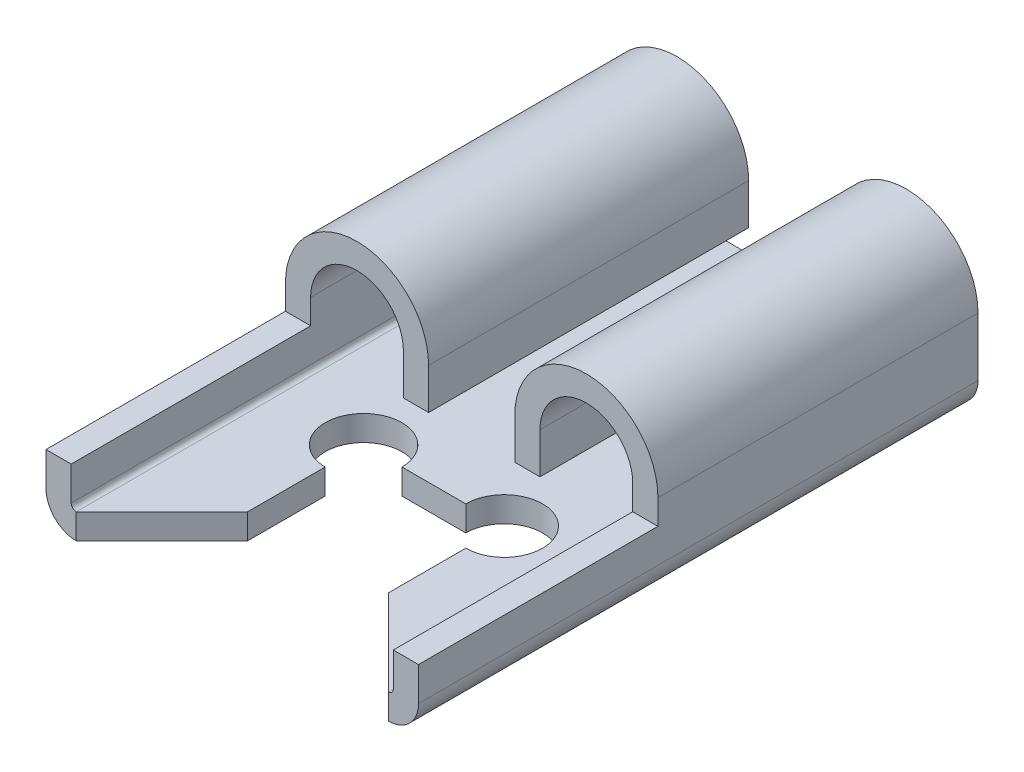
ISO-10303-21;
HEADER;
FILE_DESCRIPTION(('STEP AP214'),'2;1');
FILE_NAME('part.step','',(''),(''),'','','');
FILE_SCHEMA(('AUTOMOTIVE_DESIGN { 1 0 10303 214 1 1 1 1 }'));
ENDSEC;
DATA;
#1=APPLICATION_CONTEXT('core data for automotive mechanical design processes');
#2=APPLICATION_PROTOCOL_DEFINITION('international standard','automotive_design',2000,#1);
#3=PRODUCT_CONTEXT('',#1,'mechanical');
#4=PRODUCT('Part','Part','',(#3));
#5=PRODUCT_RELATED_PRODUCT_CATEGORY('part','',(#4));
#6=PRODUCT_DEFINITION_FORMATION('','',#4);
#7=PRODUCT_DEFINITION_CONTEXT('part definition',#1,'design');
#8=PRODUCT_DEFINITION('design','',#6,#7);
#9=PRODUCT_DEFINITION_SHAPE('','',#8);
#10=(LENGTH_UNIT() NAMED_UNIT(*) SI_UNIT(.MILLI.,.METRE.));
#11=(NAMED_UNIT(*) PLANE_ANGLE_UNIT() SI_UNIT($,.RADIAN.));
#12=(NAMED_UNIT(*) SI_UNIT($,.STERADIAN.) SOLID_ANGLE_UNIT());
#13=UNCERTAINTY_MEASURE_WITH_UNIT(LENGTH_MEASURE(1.E-05),#10,'distance_accuracy_value','');
#14=(GEOMETRIC_REPRESENTATION_CONTEXT(3) GLOBAL_UNCERTAINTY_ASSIGNED_CONTEXT((#13)) GLOBAL_UNIT_ASSIGNED_CONTEXT((#10,
#11,#12)) REPRESENTATION_CONTEXT('',''));
#15=CARTESIAN_POINT('',(0.,0.,0.));
#16=DIRECTION('',(0.,0.,1.));
#17=DIRECTION('',(1.,0.,0.));
#18=AXIS2_PLACEMENT_3D('',#15,#16,#17);
#19=CARTESIAN_POINT('',(-2.275,1.76,-11.1));
#20=DIRECTION('',(0.,0.,1.));
#21=DIRECTION('',(1.,0.,0.));
#22=AXIS2_PLACEMENT_3D('',#19,#20,#21);
#23=CYLINDRICAL_SURFACE('',#22,1.42);
#24=DIRECTION('',(0.,0.,1.));
#25=VECTOR('',#24,1.);
#26=CARTESIAN_POINT('',(-3.695,1.76,-11.1));
#27=LINE('',#26,#25);
#28=CARTESIAN_POINT('',(-3.695,1.76,-11.1));
#29=VERTEX_POINT('',#28);
#30=CARTESIAN_POINT('',(-3.695,1.76,-4.75));
#31=VERTEX_POINT('',#30);
#32=EDGE_CURVE('E432',#29,#31,#27,.T.);
#33=ORIENTED_EDGE('',*,*,#32,.T.);
#34=CARTESIAN_POINT('',(-2.275,1.76,-4.75));
#35=DIRECTION('',(0.,0.,1.));
#36=DIRECTION('',(1.,0.,0.));
#37=AXIS2_PLACEMENT_3D('',#34,#35,#36);
#38=CIRCLE('',#37,1.42);
#39=CARTESIAN_POINT('',(-0.855,1.76,-4.75));
#40=VERTEX_POINT('',#39);
#41=EDGE_CURVE('E233',#31,#40,#38,.F.);
#42=ORIENTED_EDGE('',*,*,#41,.T.);
#43=DIRECTION('',(0.,0.,1.));
#44=VECTOR('',#43,1.);
#45=CARTESIAN_POINT('',(-0.855,1.76,-11.1));
#46=LINE('',#45,#44);
#47=CARTESIAN_POINT('',(-0.855,1.76,-11.1));
#48=VERTEX_POINT('',#47);
#49=EDGE_CURVE('E434',#48,#40,#46,.T.);
#50=ORIENTED_EDGE('',*,*,#49,.F.);
#51=CARTESIAN_POINT('',(-2.275,1.76,-11.1));
#52=DIRECTION('',(0.,0.,1.));
#53=DIRECTION('',(1.,0.,0.));
#54=AXIS2_PLACEMENT_3D('',#51,#52,#53);
#55=CIRCLE('',#54,1.42);
#56=EDGE_CURVE('E403',#48,#29,#55,.T.);
#57=ORIENTED_EDGE('',*,*,#56,.T.);
#58=EDGE_LOOP('',(#33,#42,#50,#57));
#59=FACE_BOUND('',#58,.T.);
#60=ADVANCED_FACE('F35',(#59),#23,.T.);
#61=CARTESIAN_POINT('',(-0.855,1.76,-11.1));
#62=DIRECTION('',(1.,0.,0.));
#63=DIRECTION('',(0.,1.,0.));
#64=AXIS2_PLACEMENT_3D('',#61,#62,#63);
#65=PLANE('',#64);
#66=ORIENTED_EDGE('',*,*,#49,.T.);
#67=DIRECTION('',(0.,-1.,0.));
#68=VECTOR('',#67,1.);
#69=CARTESIAN_POINT('',(-0.855,1.76,-4.75));
#70=LINE('',#69,#68);
#71=CARTESIAN_POINT('',(-0.855,0.95,-4.75));
#72=VERTEX_POINT('',#71);
#73=EDGE_CURVE('E289',#40,#72,#70,.T.);
#74=ORIENTED_EDGE('',*,*,#73,.T.);
#75=DIRECTION('',(0.,0.,1.));
#76=VECTOR('',#75,1.);
#77=CARTESIAN_POINT('',(-0.855,0.95,-11.1));
#78=LINE('',#77,#76);
#79=CARTESIAN_POINT('',(-0.855,0.95,-11.1));
#80=VERTEX_POINT('',#79);
#81=EDGE_CURVE('E437',#80,#72,#78,.T.);
#82=ORIENTED_EDGE('',*,*,#81,.F.);
#83=DIRECTION('',(0.,1.,0.));
#84=VECTOR('',#83,1.);
#85=CARTESIAN_POINT('',(-0.855,1.76,-11.1));
#86=LINE('',#85,#84);
#87=EDGE_CURVE('E400',#80,#48,#86,.T.);
#88=ORIENTED_EDGE('',*,*,#87,.T.);
#89=EDGE_LOOP('',(#66,#74,#82,#88));
#90=FACE_BOUND('',#89,.T.);
#91=ADVANCED_FACE('F545',(#90),#65,.T.);
#92=CARTESIAN_POINT('',(-1.355,0.95,-11.1));
#93=DIRECTION('',(0.,-1.,0.));
#94=DIRECTION('',(1.,0.,0.));
#95=AXIS2_PLACEMENT_3D('',#92,#93,#94);
#96=PLANE('',#95);
#97=ORIENTED_EDGE('',*,*,#81,.T.);
#98=DIRECTION('',(-1.,0.,0.));
#99=VECTOR('',#98,1.);
#100=CARTESIAN_POINT('',(-1.355,0.95,-4.75));
#101=LINE('',#100,#99);
#102=CARTESIAN_POINT('',(-1.355,0.95,-4.75));
#103=VERTEX_POINT('',#102);
#104=EDGE_CURVE('E286',#72,#103,#101,.T.);
#105=ORIENTED_EDGE('',*,*,#104,.T.);
#106=DIRECTION('',(0.,0.,1.));
#107=VECTOR('',#106,1.);
#108=CARTESIAN_POINT('',(-1.355,0.95,-11.1));
#109=LINE('',#108,#107);
#110=CARTESIAN_POINT('',(-1.355,0.95,-11.1));
#111=VERTEX_POINT('',#110);
#112=EDGE_CURVE('E440',#111,#103,#109,.T.);
#113=ORIENTED_EDGE('',*,*,#112,.F.);
#114=DIRECTION('',(1.,0.,0.));
#115=VECTOR('',#114,1.);
#116=CARTESIAN_POINT('',(-1.355,0.95,-11.1));
#117=LINE('',#116,#115);
#118=EDGE_CURVE('E397',#111,#80,#117,.T.);
#119=ORIENTED_EDGE('',*,*,#118,.T.);
#120=EDGE_LOOP('',(#97,#105,#113,#119));
#121=FACE_BOUND('',#120,.T.);
#122=ADVANCED_FACE('F540',(#121),#96,.T.);
#123=CARTESIAN_POINT('',(-1.355,1.76,-11.1));
#124=DIRECTION('',(-1.,0.,0.));
#125=DIRECTION('',(0.,0.,1.));
#126=AXIS2_PLACEMENT_3D('',#123,#124,#125);
#127=PLANE('',#126);
#128=ORIENTED_EDGE('',*,*,#112,.T.);
#129=DIRECTION('',(0.,1.,0.));
#130=VECTOR('',#129,1.);
#131=CARTESIAN_POINT('',(-1.355,1.76,-4.75));
#132=LINE('',#131,#130);
#133=CARTESIAN_POINT('',(-1.355,1.76,-4.75));
#134=VERTEX_POINT('',#133);
#135=EDGE_CURVE('E283',#103,#134,#132,.T.);
#136=ORIENTED_EDGE('',*,*,#135,.T.);
#137=DIRECTION('',(0.,0.,1.));
#138=VECTOR('',#137,1.);
#139=CARTESIAN_POINT('',(-1.355,1.76,-11.1));
#140=LINE('',#139,#138);
#141=CARTESIAN_POINT('',(-1.355,1.76,-11.1));
#142=VERTEX_POINT('',#141);
#143=EDGE_CURVE('E443',#142,#134,#140,.T.);
#144=ORIENTED_EDGE('',*,*,#143,.F.);
#145=DIRECTION('',(0.,-1.,0.));
#146=VECTOR('',#145,1.);
#147=CARTESIAN_POINT('',(-1.355,1.76,-11.1));
#148=LINE('',#147,#146);
#149=EDGE_CURVE('E394',#142,#111,#148,.T.);
#150=ORIENTED_EDGE('',*,*,#149,.T.);
#151=EDGE_LOOP('',(#128,#136,#144,#150));
#152=FACE_BOUND('',#151,.T.);
#153=ADVANCED_FACE('F538',(#152),#127,.T.);
#154=CARTESIAN_POINT('',(-2.275,1.76,-11.1));
#155=DIRECTION('',(0.,0.,1.));
#156=DIRECTION('',(1.,0.,0.));
#157=AXIS2_PLACEMENT_3D('',#154,#155,#156);
#158=CYLINDRICAL_SURFACE('',#157,0.92);
#159=ORIENTED_EDGE('',*,*,#143,.T.);
#160=CARTESIAN_POINT('',(-2.275,1.76,-4.75));
#161=DIRECTION('',(0.,0.,1.));
#162=DIRECTION('',(1.,0.,0.));
#163=AXIS2_PLACEMENT_3D('',#160,#161,#162);
#164=CIRCLE('',#163,0.92);
#165=CARTESIAN_POINT('',(-3.195,1.76,-4.75));
#166=VERTEX_POINT('',#165);
#167=EDGE_CURVE('E280',#134,#166,#164,.T.);
#168=ORIENTED_EDGE('',*,*,#167,.T.);
#169=DIRECTION('',(0.,0.,1.));
#170=VECTOR('',#169,1.);
#171=CARTESIAN_POINT('',(-3.195,1.76,-11.1));
#172=LINE('',#171,#170);
#173=CARTESIAN_POINT('',(-3.195,1.76,-11.1));
#174=VERTEX_POINT('',#173);
#175=EDGE_CURVE('E446',#174,#166,#172,.T.);
#176=ORIENTED_EDGE('',*,*,#175,.F.);
#177=CARTESIAN_POINT('',(-2.275,1.76,-11.1));
#178=DIRECTION('',(0.,0.,-1.));
#179=DIRECTION('',(1.,0.,0.));
#180=AXIS2_PLACEMENT_3D('',#177,#178,#179);
#181=CIRCLE('',#180,0.92);
#182=EDGE_CURVE('E391',#174,#142,#181,.T.);
#183=ORIENTED_EDGE('',*,*,#182,.T.);
#184=EDGE_LOOP('',(#159,#168,#176,#183));
#185=FACE_BOUND('',#184,.T.);
#186=ADVANCED_FACE('F536',(#185),#158,.F.);
#187=CARTESIAN_POINT('',(2.275,1.76,-11.1));
#188=DIRECTION('',(0.,0.,1.));
#189=DIRECTION('',(1.,0.,0.));
#190=AXIS2_PLACEMENT_3D('',#187,#188,#189);
#191=CYLINDRICAL_SURFACE('',#190,0.92);
#192=DIRECTION('',(0.,0.,1.));
#193=VECTOR('',#192,1.);
#194=CARTESIAN_POINT('',(3.195,1.76,-11.1));
#195=LINE('',#194,#193);
#196=CARTESIAN_POINT('',(3.195,1.76,-11.1));
#197=VERTEX_POINT('',#196);
#198=CARTESIAN_POINT('',(3.195,1.76,-4.75));
#199=VERTEX_POINT('',#198);
#200=EDGE_CURVE('E460',#197,#199,#195,.T.);
#201=ORIENTED_EDGE('',*,*,#200,.T.);
#202=CARTESIAN_POINT('',(2.275,1.76,-4.75));
#203=DIRECTION('',(0.,0.,1.));
#204=DIRECTION('',(1.,0.,0.));
#205=AXIS2_PLACEMENT_3D('',#202,#203,#204);
#206=CIRCLE('',#205,0.92);
#207=CARTESIAN_POINT('',(1.355,1.76,-4.75));
#208=VERTEX_POINT('',#207);
#209=EDGE_CURVE('E272',#199,#208,#206,.T.);
#210=ORIENTED_EDGE('',*,*,#209,.T.);
#211=DIRECTION('',(0.,0.,1.));
#212=VECTOR('',#211,1.);
#213=CARTESIAN_POINT('',(1.355,1.76,-11.1));
#214=LINE('',#213,#212);
#215=CARTESIAN_POINT('',(1.355,1.76,-11.1));
#216=VERTEX_POINT('',#215);
#217=EDGE_CURVE('E463',#216,#208,#214,.T.);
#218=ORIENTED_EDGE('',*,*,#217,.F.);
#219=CARTESIAN_POINT('',(2.275,1.76,-11.1));
#220=DIRECTION('',(0.,0.,-1.));
#221=DIRECTION('',(-1.,0.,0.));
#222=AXIS2_PLACEMENT_3D('',#219,#220,#221);
#223=CIRCLE('',#222,0.92);
#224=EDGE_CURVE('E374',#216,#197,#223,.T.);
#225=ORIENTED_EDGE('',*,*,#224,.T.);
#226=EDGE_LOOP('',(#201,#210,#218,#225));
#227=FACE_BOUND('',#226,.T.);
#228=ADVANCED_FACE('F559',(#227),#191,.F.);
#229=CARTESIAN_POINT('',(1.355,1.76,-11.1));
#230=DIRECTION('',(1.,0.,0.));
#231=DIRECTION('',(0.,1.,0.));
#232=AXIS2_PLACEMENT_3D('',#229,#230,#231);
#233=PLANE('',#232);
#234=ORIENTED_EDGE('',*,*,#217,.T.);
#235=DIRECTION('',(0.,-1.,0.));
#236=VECTOR('',#235,1.);
#237=CARTESIAN_POINT('',(1.355,1.76,-4.75));
#238=LINE('',#237,#236);
#239=CARTESIAN_POINT('',(1.355,0.95,-4.75));
#240=VERTEX_POINT('',#239);
#241=EDGE_CURVE('E269',#208,#240,#238,.T.);
#242=ORIENTED_EDGE('',*,*,#241,.T.);
#243=DIRECTION('',(0.,0.,1.));
#244=VECTOR('',#243,1.);
#245=CARTESIAN_POINT('',(1.355,0.95,-11.1));
#246=LINE('',#245,#244);
#247=CARTESIAN_POINT('',(1.355,0.95,-11.1));
#248=VERTEX_POINT('',#247);
#249=EDGE_CURVE('E466',#248,#240,#246,.T.);
#250=ORIENTED_EDGE('',*,*,#249,.F.);
#251=DIRECTION('',(0.,1.,0.));
#252=VECTOR('',#251,1.);
#253=CARTESIAN_POINT('',(1.355,1.76,-11.1));
#254=LINE('',#253,#252);
#255=EDGE_CURVE('E371',#248,#216,#254,.T.);
#256=ORIENTED_EDGE('',*,*,#255,.T.);
#257=EDGE_LOOP('',(#234,#242,#250,#256));
#258=FACE_BOUND('',#257,.T.);
#259=ADVANCED_FACE('F561',(#258),#233,.T.);
#260=CARTESIAN_POINT('',(1.355,0.95,-11.1));
#261=DIRECTION('',(0.,-1.,0.));
#262=DIRECTION('',(1.,0.,0.));
#263=AXIS2_PLACEMENT_3D('',#260,#261,#262);
#264=PLANE('',#263);
#265=ORIENTED_EDGE('',*,*,#249,.T.);
#266=DIRECTION('',(-1.,0.,0.));
#267=VECTOR('',#266,1.);
#268=CARTESIAN_POINT('',(1.355,0.95,-4.75));
#269=LINE('',#268,#267);
#270=CARTESIAN_POINT('',(0.855,0.95,-4.75));
#271=VERTEX_POINT('',#270);
#272=EDGE_CURVE('E266',#240,#271,#269,.T.);
#273=ORIENTED_EDGE('',*,*,#272,.T.);
#274=DIRECTION('',(0.,0.,1.));
#275=VECTOR('',#274,1.);
#276=CARTESIAN_POINT('',(0.855,0.95,-11.1));
#277=LINE('',#276,#275);
#278=CARTESIAN_POINT('',(0.855,0.95,-11.1));
#279=VERTEX_POINT('',#278);
#280=EDGE_CURVE('E469',#279,#271,#277,.T.);
#281=ORIENTED_EDGE('',*,*,#280,.F.);
#282=DIRECTION('',(1.,0.,0.));
#283=VECTOR('',#282,1.);
#284=CARTESIAN_POINT('',(1.355,0.95,-11.1));
#285=LINE('',#284,#283);
#286=EDGE_CURVE('E368',#279,#248,#285,.T.);
#287=ORIENTED_EDGE('',*,*,#286,.T.);
#288=EDGE_LOOP('',(#265,#273,#281,#287));
#289=FACE_BOUND('',#288,.T.);
#290=ADVANCED_FACE('F565',(#289),#264,.T.);
#291=CARTESIAN_POINT('',(0.855,1.76,-11.1));
#292=DIRECTION('',(-1.,0.,0.));
#293=DIRECTION('',(0.,-1.,0.));
#294=AXIS2_PLACEMENT_3D('',#291,#292,#293);
#295=PLANE('',#294);
#296=ORIENTED_EDGE('',*,*,#280,.T.);
#297=DIRECTION('',(0.,1.,0.));
#298=VECTOR('',#297,1.);
#299=CARTESIAN_POINT('',(0.855,1.76,-4.75));
#300=LINE('',#299,#298);
#301=CARTESIAN_POINT('',(0.855,1.76,-4.75));
#302=VERTEX_POINT('',#301);
#303=EDGE_CURVE('E263',#271,#302,#300,.T.);
#304=ORIENTED_EDGE('',*,*,#303,.T.);
#305=DIRECTION('',(0.,0.,1.));
#306=VECTOR('',#305,1.);
#307=CARTESIAN_POINT('',(0.855,1.76,-11.1));
#308=LINE('',#307,#306);
#309=CARTESIAN_POINT('',(0.855,1.76,-11.1));
#310=VERTEX_POINT('',#309);
#311=EDGE_CURVE('E472',#310,#302,#308,.T.);
#312=ORIENTED_EDGE('',*,*,#311,.F.);
#313=DIRECTION('',(0.,-1.,0.));
#314=VECTOR('',#313,1.);
#315=CARTESIAN_POINT('',(0.855,1.76,-11.1));
#316=LINE('',#315,#314);
#317=EDGE_CURVE('E365',#310,#279,#316,.T.);
#318=ORIENTED_EDGE('',*,*,#317,.T.);
#319=EDGE_LOOP('',(#296,#304,#312,#318));
#320=FACE_BOUND('',#319,.T.);
#321=ADVANCED_FACE('F567',(#320),#295,.T.);
#322=CARTESIAN_POINT('',(2.275,1.76,-11.1));
#323=DIRECTION('',(0.,0.,1.));
#324=DIRECTION('',(1.,0.,0.));
#325=AXIS2_PLACEMENT_3D('',#322,#323,#324);
#326=CYLINDRICAL_SURFACE('',#325,1.42);
#327=ORIENTED_EDGE('',*,*,#311,.T.);
#328=CARTESIAN_POINT('',(2.275,1.76,-4.75));
#329=DIRECTION('',(0.,0.,1.));
#330=DIRECTION('',(1.,0.,0.));
#331=AXIS2_PLACEMENT_3D('',#328,#329,#330);
#332=CIRCLE('',#331,1.42);
#333=CARTESIAN_POINT('',(3.695,1.76,-4.75));
#334=VERTEX_POINT('',#333);
#335=EDGE_CURVE('E260',#302,#334,#332,.F.);
#336=ORIENTED_EDGE('',*,*,#335,.T.);
#337=DIRECTION('',(0.,0.,1.));
#338=VECTOR('',#337,1.);
#339=CARTESIAN_POINT('',(3.695,1.76,-11.1));
#340=LINE('',#339,#338);
#341=CARTESIAN_POINT('',(3.695,1.76,-11.1));
#342=VERTEX_POINT('',#341);
#343=EDGE_CURVE('E475',#342,#334,#340,.T.);
#344=ORIENTED_EDGE('',*,*,#343,.F.);
#345=CARTESIAN_POINT('',(2.275,1.76,-11.1));
#346=DIRECTION('',(0.,0.,1.));
#347=DIRECTION('',(-1.,0.,0.));
#348=AXIS2_PLACEMENT_3D('',#345,#346,#347);
#349=CIRCLE('',#348,1.42);
#350=EDGE_CURVE('E362',#342,#310,#349,.T.);
#351=ORIENTED_EDGE('',*,*,#350,.T.);
#352=EDGE_LOOP('',(#327,#336,#344,#351));
#353=FACE_BOUND('',#352,.T.);
#354=ADVANCED_FACE('F570',(#353),#326,.T.);
#355=CARTESIAN_POINT('',(-3.095,0.599999999999999,0.));
#356=DIRECTION('',(0.,0.,-1.));
#357=DIRECTION('',(-1.,0.,0.));
#358=AXIS2_PLACEMENT_3D('',#355,#356,#357);
#359=PLANE('',#358);
#360=DIRECTION('',(0.,1.,0.));
#361=VECTOR('',#360,1.);
#362=CARTESIAN_POINT('',(-3.195,0.599999999999999,0.));
#363=LINE('',#362,#361);
#364=CARTESIAN_POINT('',(-3.195,0.599999999999999,0.));
#365=VERTEX_POINT('',#364);
#366=CARTESIAN_POINT('',(-3.195,1.27,0.));
#367=VERTEX_POINT('',#366);
#368=EDGE_CURVE('E426',#365,#367,#363,.T.);
#369=ORIENTED_EDGE('',*,*,#368,.T.);
#370=DIRECTION('',(1.,0.,0.));
#371=VECTOR('',#370,1.);
#372=CARTESIAN_POINT('',(-3.695,1.27,0.));
#373=LINE('',#372,#371);
#374=CARTESIAN_POINT('',(-3.695,1.27,0.));
#375=VERTEX_POINT('',#374);
#376=EDGE_CURVE('E237',#375,#367,#373,.T.);
#377=ORIENTED_EDGE('',*,*,#376,.F.);
#378=DIRECTION('',(0.,-1.,0.));
#379=VECTOR('',#378,1.);
#380=CARTESIAN_POINT('',(-3.695,0.599999999999999,0.));
#381=LINE('',#380,#379);
#382=CARTESIAN_POINT('',(-3.695,0.599999999999999,0.));
#383=VERTEX_POINT('',#382);
#384=EDGE_CURVE('E250',#375,#383,#381,.T.);
#385=ORIENTED_EDGE('',*,*,#384,.T.);
#386=CARTESIAN_POINT('',(-3.095,0.599999999999999,0.));
#387=DIRECTION('',(0.,0.,1.));
#388=DIRECTION('',(-1.,0.,0.));
#389=AXIS2_PLACEMENT_3D('',#386,#387,#388);
#390=CIRCLE('',#389,0.6);
#391=CARTESIAN_POINT('',(-3.095,0.,0.));
#392=VERTEX_POINT('',#391);
#393=EDGE_CURVE('E349',#383,#392,#390,.T.);
#394=ORIENTED_EDGE('',*,*,#393,.T.);
#395=DIRECTION('',(0.,-1.,0.));
#396=VECTOR('',#395,1.);
#397=CARTESIAN_POINT('',(-3.095,3.181,0.));
#398=LINE('',#397,#396);
#399=CARTESIAN_POINT('',(-3.095,0.499999999999999,0.));
#400=VERTEX_POINT('',#399);
#401=EDGE_CURVE('E347',#400,#392,#398,.T.);
#402=ORIENTED_EDGE('',*,*,#401,.F.);
#403=CARTESIAN_POINT('',(-3.095,0.599999999999999,0.));
#404=DIRECTION('',(0.,0.,-1.));
#405=DIRECTION('',(-1.,0.,0.));
#406=AXIS2_PLACEMENT_3D('',#403,#404,#405);
#407=CIRCLE('',#406,0.0999999999999998);
#408=EDGE_CURVE('E423',#400,#365,#407,.T.);
#409=ORIENTED_EDGE('',*,*,#408,.T.);
#410=EDGE_LOOP('',(#369,#377,#385,#394,#402,#409));
#411=FACE_BOUND('',#410,.T.);
#412=ADVANCED_FACE('F520',(#411),#359,.F.);
#413=CARTESIAN_POINT('',(-3.095,0.599999999999999,-11.1));
#414=DIRECTION('',(0.,0.,1.));
#415=DIRECTION('',(1.,0.,0.));
#416=AXIS2_PLACEMENT_3D('',#413,#414,#415);
#417=CYLINDRICAL_SURFACE('',#416,0.6);
#418=ORIENTED_EDGE('',*,*,#393,.F.);
#419=DIRECTION('',(0.,0.,1.));
#420=VECTOR('',#419,1.);
#421=CARTESIAN_POINT('',(-3.695,0.599999999999999,-11.1));
#422=LINE('',#421,#420);
#423=CARTESIAN_POINT('',(-3.695,0.599999999999999,-11.1));
#424=VERTEX_POINT('',#423);
#425=EDGE_CURVE('E430',#424,#383,#422,.T.);
#426=ORIENTED_EDGE('',*,*,#425,.F.);
#427=CARTESIAN_POINT('',(-3.095,0.599999999999999,-11.1));
#428=DIRECTION('',(0.,0.,1.));
#429=DIRECTION('',(-1.,0.,0.));
#430=AXIS2_PLACEMENT_3D('',#427,#428,#429);
#431=CIRCLE('',#430,0.6);
#432=CARTESIAN_POINT('',(-3.095,0.,-11.1));
#433=VERTEX_POINT('',#432);
#434=EDGE_CURVE('E351',#424,#433,#431,.T.);
#435=ORIENTED_EDGE('',*,*,#434,.T.);
#436=DIRECTION('',(0.,0.,1.));
#437=VECTOR('',#436,1.);
#438=CARTESIAN_POINT('',(-3.095,0.,-11.1));
#439=LINE('',#438,#437);
#440=EDGE_CURVE('E409',#433,#392,#439,.T.);
#441=ORIENTED_EDGE('',*,*,#440,.T.);
#442=EDGE_LOOP('',(#418,#426,#435,#441));
#443=FACE_BOUND('',#442,.T.);
#444=ADVANCED_FACE('F37',(#443),#417,.T.);
#445=CARTESIAN_POINT('',(-3.695,0.599999999999999,-11.1));
#446=DIRECTION('',(-1.,0.,0.));
#447=DIRECTION('',(0.,-1.,0.));
#448=AXIS2_PLACEMENT_3D('',#445,#446,#447);
#449=PLANE('',#448);
#450=DIRECTION('',(0.,0.,1.));
#451=VECTOR('',#450,1.);
#452=CARTESIAN_POINT('',(-3.695,1.27,-4.75));
#453=LINE('',#452,#451);
#454=CARTESIAN_POINT('',(-3.695,1.27,-4.75));
#455=VERTEX_POINT('',#454);
#456=EDGE_CURVE('E241',#455,#375,#453,.T.);
#457=ORIENTED_EDGE('',*,*,#456,.F.);
#458=DIRECTION('',(0.,-1.,0.));
#459=VECTOR('',#458,1.);
#460=CARTESIAN_POINT('',(-3.695,3.31172477789102,-4.75));
#461=LINE('',#460,#459);
#462=EDGE_CURVE('E230',#31,#455,#461,.T.);
#463=ORIENTED_EDGE('',*,*,#462,.F.);
#464=ORIENTED_EDGE('',*,*,#32,.F.);
#465=DIRECTION('',(0.,-1.,0.));
#466=VECTOR('',#465,1.);
#467=CARTESIAN_POINT('',(-3.695,0.599999999999999,-11.1));
#468=LINE('',#467,#466);
#469=EDGE_CURVE('E406',#29,#424,#468,.T.);
#470=ORIENTED_EDGE('',*,*,#469,.T.);
#471=ORIENTED_EDGE('',*,*,#425,.T.);
#472=ORIENTED_EDGE('',*,*,#384,.F.);
#473=EDGE_LOOP('',(#457,#463,#464,#470,#471,#472));
#474=FACE_BOUND('',#473,.T.);
#475=ADVANCED_FACE('F248',(#474),#449,.T.);
#476=CARTESIAN_POINT('',(-3.195,0.599999999999999,-11.1));
#477=DIRECTION('',(1.,0.,0.));
#478=DIRECTION('',(0.,0.,-1.));
#479=AXIS2_PLACEMENT_3D('',#476,#477,#478);
#480=PLANE('',#479);
#481=DIRECTION('',(0.,0.,-1.));
#482=VECTOR('',#481,1.);
#483=CARTESIAN_POINT('',(-3.195,1.27,-11.1));
#484=LINE('',#483,#482);
#485=CARTESIAN_POINT('',(-3.195,1.27,-4.75));
#486=VERTEX_POINT('',#485);
#487=EDGE_CURVE('E11',#367,#486,#484,.T.);
#488=ORIENTED_EDGE('',*,*,#487,.F.);
#489=ORIENTED_EDGE('',*,*,#368,.F.);
#490=DIRECTION('',(0.,0.,1.));
#491=VECTOR('',#490,1.);
#492=CARTESIAN_POINT('',(-3.195,0.599999999999999,-11.1));
#493=LINE('',#492,#491);
#494=CARTESIAN_POINT('',(-3.195,0.599999999999999,-11.1));
#495=VERTEX_POINT('',#494);
#496=EDGE_CURVE('E449',#495,#365,#493,.T.);
#497=ORIENTED_EDGE('',*,*,#496,.F.);
#498=DIRECTION('',(0.,1.,0.));
#499=VECTOR('',#498,1.);
#500=CARTESIAN_POINT('',(-3.195,0.599999999999999,-11.1));
#501=LINE('',#500,#499);
#502=EDGE_CURVE('E388',#495,#174,#501,.T.);
#503=ORIENTED_EDGE('',*,*,#502,.T.);
#504=ORIENTED_EDGE('',*,*,#175,.T.);
#505=DIRECTION('',(0.,-1.,0.));
#506=VECTOR('',#505,1.);
#507=CARTESIAN_POINT('',(-3.195,0.599999999999999,-4.75));
#508=LINE('',#507,#506);
#509=EDGE_CURVE('E278',#166,#486,#508,.T.);
#510=ORIENTED_EDGE('',*,*,#509,.T.);
#511=EDGE_LOOP('',(#488,#489,#497,#503,#504,#510));
#512=FACE_BOUND('',#511,.T.);
#513=ADVANCED_FACE('F519',(#512),#480,.T.);
#514=CARTESIAN_POINT('',(-3.095,0.599999999999999,-11.1));
#515=DIRECTION('',(0.,0.,1.));
#516=DIRECTION('',(1.,0.,0.));
#517=AXIS2_PLACEMENT_3D('',#514,#515,#516);
#518=CYLINDRICAL_SURFACE('',#517,0.0999999999999998);
#519=ORIENTED_EDGE('',*,*,#408,.F.);
#520=DIRECTION('',(0.,0.,1.));
#521=VECTOR('',#520,1.);
#522=CARTESIAN_POINT('',(-3.095,0.499999999999999,-11.1));
#523=LINE('',#522,#521);
#524=CARTESIAN_POINT('',(-3.095,0.499999999999999,-11.1));
#525=VERTEX_POINT('',#524);
#526=EDGE_CURVE('E451',#525,#400,#523,.T.);
#527=ORIENTED_EDGE('',*,*,#526,.F.);
#528=CARTESIAN_POINT('',(-3.095,0.599999999999999,-11.1));
#529=DIRECTION('',(0.,0.,-1.));
#530=DIRECTION('',(-1.,0.,0.));
#531=AXIS2_PLACEMENT_3D('',#528,#529,#530);
#532=CIRCLE('',#531,0.0999999999999998);
#533=EDGE_CURVE('E385',#525,#495,#532,.T.);
#534=ORIENTED_EDGE('',*,*,#533,.T.);
#535=ORIENTED_EDGE('',*,*,#496,.T.);
#536=EDGE_LOOP('',(#519,#527,#534,#535));
#537=FACE_BOUND('',#536,.T.);
#538=ADVANCED_FACE('F525',(#537),#518,.F.);
#539=CARTESIAN_POINT('',(0.,0.5,-11.1));
#540=DIRECTION('',(0.,1.,0.));
#541=DIRECTION('',(-1.,0.,0.));
#542=AXIS2_PLACEMENT_3D('',#539,#540,#541);
#543=PLANE('',#542);
#544=DIRECTION('',(0.70710678118655,0.,-0.707106781186545));
#545=VECTOR('',#544,1.);
#546=CARTESIAN_POINT('',(-3.095,0.499999999999999,0.));
#547=LINE('',#546,#545);
#548=CARTESIAN_POINT('',(-1.395,0.499999999999999,-1.69999999999999));
#549=VERTEX_POINT('',#548);
#550=EDGE_CURVE('E294',#400,#549,#547,.T.);
#551=ORIENTED_EDGE('',*,*,#550,.T.);
#552=DIRECTION('',(0.,0.,-1.));
#553=VECTOR('',#552,1.);
#554=CARTESIAN_POINT('',(-1.395,0.5,-1.69999999999999));
#555=LINE('',#554,#553);
#556=CARTESIAN_POINT('',(-1.395,0.5,-3.238));
#557=VERTEX_POINT('',#556);
#558=EDGE_CURVE('E342',#549,#557,#555,.T.);
#559=ORIENTED_EDGE('',*,*,#558,.T.);
#560=CARTESIAN_POINT('',(-1.395,0.5,-4.));
#561=DIRECTION('',(0.,1.,0.));
#562=DIRECTION('',(-1.,0.,0.));
#563=AXIS2_PLACEMENT_3D('',#560,#561,#562);
#564=CIRCLE('',#563,0.762);
#565=CARTESIAN_POINT('',(-0.633,0.5,-4.));
#566=VERTEX_POINT('',#565);
#567=EDGE_CURVE('E302',#557,#566,#564,.F.);
#568=ORIENTED_EDGE('',*,*,#567,.T.);
#569=DIRECTION('',(1.,0.,0.));
#570=VECTOR('',#569,1.);
#571=CARTESIAN_POINT('',(-0.632999999999998,0.5,-4.));
#572=LINE('',#571,#570);
#573=CARTESIAN_POINT('',(0.633000000000001,0.5,-4.));
#574=VERTEX_POINT('',#573);
#575=EDGE_CURVE('E301',#566,#574,#572,.T.);
#576=ORIENTED_EDGE('',*,*,#575,.T.);
#577=CARTESIAN_POINT('',(1.395,0.5,-4.));
#578=DIRECTION('',(0.,1.,0.));
#579=DIRECTION('',(-1.,0.,0.));
#580=AXIS2_PLACEMENT_3D('',#577,#578,#579);
#581=CIRCLE('',#580,0.762);
#582=CARTESIAN_POINT('',(1.395,0.5,-3.238));
#583=VERTEX_POINT('',#582);
#584=EDGE_CURVE('E305',#574,#583,#581,.F.);
#585=ORIENTED_EDGE('',*,*,#584,.T.);
#586=DIRECTION('',(0.,0.,1.));
#587=VECTOR('',#586,1.);
#588=CARTESIAN_POINT('',(1.395,0.5,-1.69999999999999));
#589=LINE('',#588,#587);
#590=CARTESIAN_POINT('',(1.395,0.5,-1.69999999999999));
#591=VERTEX_POINT('',#590);
#592=EDGE_CURVE('E308',#583,#591,#589,.T.);
#593=ORIENTED_EDGE('',*,*,#592,.T.);
#594=DIRECTION('',(0.70710678118655,0.,0.707106781186545));
#595=VECTOR('',#594,1.);
#596=CARTESIAN_POINT('',(3.095,0.500000000000001,0.));
#597=LINE('',#596,#595);
#598=CARTESIAN_POINT('',(3.095,0.499999999999999,0.));
#599=VERTEX_POINT('',#598);
#600=EDGE_CURVE('E311',#591,#599,#597,.T.);
#601=ORIENTED_EDGE('',*,*,#600,.T.);
#602=DIRECTION('',(0.,0.,1.));
#603=VECTOR('',#602,1.);
#604=CARTESIAN_POINT('',(3.095,0.499999999999999,-11.1));
#605=LINE('',#604,#603);
#606=CARTESIAN_POINT('',(3.095,0.499999999999999,-11.1));
#607=VERTEX_POINT('',#606);
#608=EDGE_CURVE('E454',#607,#599,#605,.T.);
#609=ORIENTED_EDGE('',*,*,#608,.F.);
#610=DIRECTION('',(-1.,0.,0.));
#611=VECTOR('',#610,1.);
#612=CARTESIAN_POINT('',(0.,0.5,-11.1));
#613=LINE('',#612,#611);
#614=EDGE_CURVE('E383',#607,#525,#613,.T.);
#615=ORIENTED_EDGE('',*,*,#614,.T.);
#616=ORIENTED_EDGE('',*,*,#526,.T.);
#617=EDGE_LOOP('',(#551,#559,#568,#576,#585,#593,#601,#609,#615,#616));
#618=FACE_BOUND('',#617,.T.);
#619=ADVANCED_FACE('F555',(#618),#543,.T.);
#620=CARTESIAN_POINT('',(3.095,0.599999999999999,-11.1));
#621=DIRECTION('',(0.,0.,1.));
#622=DIRECTION('',(1.,0.,0.));
#623=AXIS2_PLACEMENT_3D('',#620,#621,#622);
#624=CYLINDRICAL_SURFACE('',#623,0.0999999999999998);
#625=CARTESIAN_POINT('',(3.095,0.599999999999999,0.));
#626=DIRECTION('',(0.,0.,-1.));
#627=DIRECTION('',(1.,0.,0.));
#628=AXIS2_PLACEMENT_3D('',#625,#626,#627);
#629=CIRCLE('',#628,0.0999999999999998);
#630=CARTESIAN_POINT('',(3.195,0.599999999999999,0.));
#631=VERTEX_POINT('',#630);
#632=EDGE_CURVE('E420',#631,#599,#629,.T.);
#633=ORIENTED_EDGE('',*,*,#632,.F.);
#634=DIRECTION('',(0.,0.,1.));
#635=VECTOR('',#634,1.);
#636=CARTESIAN_POINT('',(3.195,0.599999999999999,-11.1));
#637=LINE('',#636,#635);
#638=CARTESIAN_POINT('',(3.195,0.599999999999999,-11.1));
#639=VERTEX_POINT('',#638);
#640=EDGE_CURVE('E457',#639,#631,#637,.T.);
#641=ORIENTED_EDGE('',*,*,#640,.F.);
#642=CARTESIAN_POINT('',(3.095,0.599999999999999,-11.1));
#643=DIRECTION('',(0.,0.,-1.));
#644=DIRECTION('',(1.,0.,0.));
#645=AXIS2_PLACEMENT_3D('',#642,#643,#644);
#646=CIRCLE('',#645,0.0999999999999998);
#647=EDGE_CURVE('E380',#639,#607,#646,.T.);
#648=ORIENTED_EDGE('',*,*,#647,.T.);
#649=ORIENTED_EDGE('',*,*,#608,.T.);
#650=EDGE_LOOP('',(#633,#641,#648,#649));
#651=FACE_BOUND('',#650,.T.);
#652=ADVANCED_FACE('F495',(#651),#624,.F.);
#653=CARTESIAN_POINT('',(3.195,0.599999999999999,-11.1));
#654=DIRECTION('',(-1.,0.,0.));
#655=DIRECTION('',(0.,0.,1.));
#656=AXIS2_PLACEMENT_3D('',#653,#654,#655);
#657=PLANE('',#656);
#658=DIRECTION('',(0.,0.,1.));
#659=VECTOR('',#658,1.);
#660=CARTESIAN_POINT('',(3.195,1.27,-11.1));
#661=LINE('',#660,#659);
#662=CARTESIAN_POINT('',(3.195,1.27,-4.75));
#663=VERTEX_POINT('',#662);
#664=CARTESIAN_POINT('',(3.195,1.27,0.));
#665=VERTEX_POINT('',#664);
#666=EDGE_CURVE('E57',#663,#665,#661,.T.);
#667=ORIENTED_EDGE('',*,*,#666,.F.);
#668=DIRECTION('',(0.,1.,0.));
#669=VECTOR('',#668,1.);
#670=CARTESIAN_POINT('',(3.195,0.599999999999999,-4.75));
#671=LINE('',#670,#669);
#672=EDGE_CURVE('E275',#663,#199,#671,.T.);
#673=ORIENTED_EDGE('',*,*,#672,.T.);
#674=ORIENTED_EDGE('',*,*,#200,.F.);
#675=DIRECTION('',(0.,-1.,0.));
#676=VECTOR('',#675,1.);
#677=CARTESIAN_POINT('',(3.195,0.599999999999999,-11.1));
#678=LINE('',#677,#676);
#679=EDGE_CURVE('E377',#197,#639,#678,.T.);
#680=ORIENTED_EDGE('',*,*,#679,.T.);
#681=ORIENTED_EDGE('',*,*,#640,.T.);
#682=DIRECTION('',(0.,-1.,0.));
#683=VECTOR('',#682,1.);
#684=CARTESIAN_POINT('',(3.195,0.599999999999999,0.));
#685=LINE('',#684,#683);
#686=EDGE_CURVE('E418',#665,#631,#685,.T.);
#687=ORIENTED_EDGE('',*,*,#686,.F.);
#688=EDGE_LOOP('',(#667,#673,#674,#680,#681,#687));
#689=FACE_BOUND('',#688,.T.);
#690=ADVANCED_FACE('F490',(#689),#657,.T.);
#691=CARTESIAN_POINT('',(3.695,0.599999999999999,-11.1));
#692=DIRECTION('',(1.,0.,0.));
#693=DIRECTION('',(0.,1.,0.));
#694=AXIS2_PLACEMENT_3D('',#691,#692,#693);
#695=PLANE('',#694);
#696=DIRECTION('',(0.,0.,1.));
#697=VECTOR('',#696,1.);
#698=CARTESIAN_POINT('',(3.695,1.27,-4.75));
#699=LINE('',#698,#697);
#700=CARTESIAN_POINT('',(3.695,1.27,-4.75));
#701=VERTEX_POINT('',#700);
#702=CARTESIAN_POINT('',(3.695,1.27,0.));
#703=VERTEX_POINT('',#702);
#704=EDGE_CURVE('E251',#701,#703,#699,.T.);
#705=ORIENTED_EDGE('',*,*,#704,.T.);
#706=DIRECTION('',(0.,1.,0.));
#707=VECTOR('',#706,1.);
#708=CARTESIAN_POINT('',(3.695,0.599999999999999,0.));
#709=LINE('',#708,#707);
#710=CARTESIAN_POINT('',(3.695,0.599999999999999,0.));
#711=VERTEX_POINT('',#710);
#712=EDGE_CURVE('E415',#711,#703,#709,.T.);
#713=ORIENTED_EDGE('',*,*,#712,.F.);
#714=DIRECTION('',(0.,0.,1.));
#715=VECTOR('',#714,1.);
#716=CARTESIAN_POINT('',(3.695,0.599999999999999,-11.1));
#717=LINE('',#716,#715);
#718=CARTESIAN_POINT('',(3.695,0.599999999999999,-11.1));
#719=VERTEX_POINT('',#718);
#720=EDGE_CURVE('E478',#719,#711,#717,.T.);
#721=ORIENTED_EDGE('',*,*,#720,.F.);
#722=DIRECTION('',(0.,1.,0.));
#723=VECTOR('',#722,1.);
#724=CARTESIAN_POINT('',(3.695,0.599999999999999,-11.1));
#725=LINE('',#724,#723);
#726=EDGE_CURVE('E359',#719,#342,#725,.T.);
#727=ORIENTED_EDGE('',*,*,#726,.T.);
#728=ORIENTED_EDGE('',*,*,#343,.T.);
#729=DIRECTION('',(0.,1.,0.));
#730=VECTOR('',#729,1.);
#731=CARTESIAN_POINT('',(3.695,3.31172477789102,-4.75));
#732=LINE('',#731,#730);
#733=EDGE_CURVE('E252',#701,#334,#732,.T.);
#734=ORIENTED_EDGE('',*,*,#733,.F.);
#735=EDGE_LOOP('',(#705,#713,#721,#727,#728,#734));
#736=FACE_BOUND('',#735,.T.);
#737=ADVANCED_FACE('F511',(#736),#695,.T.);
#738=CARTESIAN_POINT('',(3.095,0.599999999999999,-11.1));
#739=DIRECTION('',(0.,0.,1.));
#740=DIRECTION('',(1.,0.,0.));
#741=AXIS2_PLACEMENT_3D('',#738,#739,#740);
#742=CYLINDRICAL_SURFACE('',#741,0.6);
#743=CARTESIAN_POINT('',(3.095,0.599999999999999,0.));
#744=DIRECTION('',(0.,0.,1.));
#745=DIRECTION('',(1.,0.,0.));
#746=AXIS2_PLACEMENT_3D('',#743,#744,#745);
#747=CIRCLE('',#746,0.6);
#748=CARTESIAN_POINT('',(3.095,0.,0.));
#749=VERTEX_POINT('',#748);
#750=EDGE_CURVE('E412',#749,#711,#747,.T.);
#751=ORIENTED_EDGE('',*,*,#750,.F.);
#752=DIRECTION('',(0.,0.,1.));
#753=VECTOR('',#752,1.);
#754=CARTESIAN_POINT('',(3.095,0.,-11.1));
#755=LINE('',#754,#753);
#756=CARTESIAN_POINT('',(3.095,0.,-11.1));
#757=VERTEX_POINT('',#756);
#758=EDGE_CURVE('E480',#757,#749,#755,.T.);
#759=ORIENTED_EDGE('',*,*,#758,.F.);
#760=CARTESIAN_POINT('',(3.095,0.599999999999999,-11.1));
#761=DIRECTION('',(0.,0.,1.));
#762=DIRECTION('',(1.,0.,0.));
#763=AXIS2_PLACEMENT_3D('',#760,#761,#762);
#764=CIRCLE('',#763,0.6);
#765=EDGE_CURVE('E356',#757,#719,#764,.T.);
#766=ORIENTED_EDGE('',*,*,#765,.T.);
#767=ORIENTED_EDGE('',*,*,#720,.T.);
#768=EDGE_LOOP('',(#751,#759,#766,#767));
#769=FACE_BOUND('',#768,.T.);
#770=ADVANCED_FACE('F508',(#769),#742,.T.);
#771=CARTESIAN_POINT('',(0.,0.,-11.1));
#772=DIRECTION('',(0.,-1.,0.));
#773=DIRECTION('',(1.,0.,0.));
#774=AXIS2_PLACEMENT_3D('',#771,#772,#773);
#775=PLANE('',#774);
#776=DIRECTION('',(0.70710678118655,0.,-0.707106781186545));
#777=VECTOR('',#776,1.);
#778=CARTESIAN_POINT('',(-3.095,0.,0.));
#779=LINE('',#778,#777);
#780=CARTESIAN_POINT('',(-1.395,0.,-1.69999999999999));
#781=VERTEX_POINT('',#780);
#782=EDGE_CURVE('E313',#392,#781,#779,.T.);
#783=ORIENTED_EDGE('',*,*,#782,.F.);
#784=ORIENTED_EDGE('',*,*,#440,.F.);
#785=DIRECTION('',(1.,0.,0.));
#786=VECTOR('',#785,1.);
#787=CARTESIAN_POINT('',(0.,0.,-11.1));
#788=LINE('',#787,#786);
#789=EDGE_CURVE('E354',#433,#757,#788,.T.);
#790=ORIENTED_EDGE('',*,*,#789,.T.);
#791=ORIENTED_EDGE('',*,*,#758,.T.);
#792=DIRECTION('',(0.70710678118655,0.,0.707106781186545));
#793=VECTOR('',#792,1.);
#794=CARTESIAN_POINT('',(3.095,0.,0.));
#795=LINE('',#794,#793);
#796=CARTESIAN_POINT('',(1.395,0.,-1.69999999999999));
#797=VERTEX_POINT('',#796);
#798=EDGE_CURVE('E293',#797,#749,#795,.T.);
#799=ORIENTED_EDGE('',*,*,#798,.F.);
#800=DIRECTION('',(0.,0.,1.));
#801=VECTOR('',#800,1.);
#802=CARTESIAN_POINT('',(1.395,0.,-1.69999999999999));
#803=LINE('',#802,#801);
#804=CARTESIAN_POINT('',(1.395,0.,-3.238));
#805=VERTEX_POINT('',#804);
#806=EDGE_CURVE('E298',#805,#797,#803,.T.);
#807=ORIENTED_EDGE('',*,*,#806,.F.);
#808=CARTESIAN_POINT('',(1.395,0.,-4.));
#809=DIRECTION('',(0.,-1.,0.));
#810=DIRECTION('',(-1.,0.,0.));
#811=AXIS2_PLACEMENT_3D('',#808,#809,#810);
#812=CIRCLE('',#811,0.762);
#813=CARTESIAN_POINT('',(0.633,0.,-4.));
#814=VERTEX_POINT('',#813);
#815=EDGE_CURVE('E316',#814,#805,#812,.T.);
#816=ORIENTED_EDGE('',*,*,#815,.F.);
#817=DIRECTION('',(1.,0.,0.));
#818=VECTOR('',#817,1.);
#819=CARTESIAN_POINT('',(-0.632999999999999,0.,-4.));
#820=LINE('',#819,#818);
#821=CARTESIAN_POINT('',(-0.633,0.,-4.));
#822=VERTEX_POINT('',#821);
#823=EDGE_CURVE('E319',#822,#814,#820,.T.);
#824=ORIENTED_EDGE('',*,*,#823,.F.);
#825=CARTESIAN_POINT('',(-1.395,0.,-4.));
#826=DIRECTION('',(0.,-1.,0.));
#827=DIRECTION('',(1.,0.,0.));
#828=AXIS2_PLACEMENT_3D('',#825,#826,#827);
#829=CIRCLE('',#828,0.762);
#830=CARTESIAN_POINT('',(-1.395,0.,-3.238));
#831=VERTEX_POINT('',#830);
#832=EDGE_CURVE('E322',#831,#822,#829,.T.);
#833=ORIENTED_EDGE('',*,*,#832,.F.);
#834=DIRECTION('',(0.,0.,-1.));
#835=VECTOR('',#834,1.);
#836=CARTESIAN_POINT('',(-1.395,0.,-1.69999999999999));
#837=LINE('',#836,#835);
#838=EDGE_CURVE('E325',#781,#831,#837,.T.);
#839=ORIENTED_EDGE('',*,*,#838,.F.);
#840=EDGE_LOOP('',(#783,#784,#790,#791,#799,#807,#816,#824,#833,#839));
#841=FACE_BOUND('',#840,.T.);
#842=ADVANCED_FACE('F503',(#841),#775,.T.);
#843=CARTESIAN_POINT('',(-3.095,0.599999999999999,-11.1));
#844=DIRECTION('',(0.,0.,-1.));
#845=DIRECTION('',(-1.,0.,0.));
#846=AXIS2_PLACEMENT_3D('',#843,#844,#845);
#847=PLANE('',#846);
#848=ORIENTED_EDGE('',*,*,#434,.F.);
#849=ORIENTED_EDGE('',*,*,#469,.F.);
#850=ORIENTED_EDGE('',*,*,#56,.F.);
#851=ORIENTED_EDGE('',*,*,#87,.F.);
#852=ORIENTED_EDGE('',*,*,#118,.F.);
#853=ORIENTED_EDGE('',*,*,#149,.F.);
#854=ORIENTED_EDGE('',*,*,#182,.F.);
#855=ORIENTED_EDGE('',*,*,#502,.F.);
#856=ORIENTED_EDGE('',*,*,#533,.F.);
#857=ORIENTED_EDGE('',*,*,#614,.F.);
#858=ORIENTED_EDGE('',*,*,#647,.F.);
#859=ORIENTED_EDGE('',*,*,#679,.F.);
#860=ORIENTED_EDGE('',*,*,#224,.F.);
#861=ORIENTED_EDGE('',*,*,#255,.F.);
#862=ORIENTED_EDGE('',*,*,#286,.F.);
#863=ORIENTED_EDGE('',*,*,#317,.F.);
#864=ORIENTED_EDGE('',*,*,#350,.F.);
#865=ORIENTED_EDGE('',*,*,#726,.F.);
#866=ORIENTED_EDGE('',*,*,#765,.F.);
#867=ORIENTED_EDGE('',*,*,#789,.F.);
#868=EDGE_LOOP('',(#848,#849,#850,#851,#852,#853,#854,#855,#856,#857,#858,#859,#860,#861,#862,
#863,#864,#865,#866,#867));
#869=FACE_BOUND('',#868,.T.);
#870=ADVANCED_FACE('F531',(#869),#847,.T.);
#871=ORIENTED_EDGE('',*,*,#712,.T.);
#872=DIRECTION('',(-1.,0.,0.));
#873=VECTOR('',#872,1.);
#874=CARTESIAN_POINT('',(-3.095,1.27,0.));
#875=LINE('',#874,#873);
#876=EDGE_CURVE('E43',#703,#665,#875,.T.);
#877=ORIENTED_EDGE('',*,*,#876,.T.);
#878=ORIENTED_EDGE('',*,*,#686,.T.);
#879=ORIENTED_EDGE('',*,*,#632,.T.);
#880=DIRECTION('',(0.,1.,0.));
#881=VECTOR('',#880,1.);
#882=CARTESIAN_POINT('',(3.095,3.181,0.));
#883=LINE('',#882,#881);
#884=EDGE_CURVE('E332',#749,#599,#883,.T.);
#885=ORIENTED_EDGE('',*,*,#884,.F.);
#886=ORIENTED_EDGE('',*,*,#750,.T.);
#887=EDGE_LOOP('',(#871,#877,#878,#879,#885,#886));
#888=FACE_BOUND('',#887,.T.);
#889=ADVANCED_FACE('F486',(#888),#359,.F.);
#890=CARTESIAN_POINT('',(-3.095,3.181,0.));
#891=DIRECTION('',(-0.707106781186545,0.,-0.70710678118655));
#892=DIRECTION('',(-0.70710678118655,0.,0.707106781186545));
#893=AXIS2_PLACEMENT_3D('',#890,#891,#892);
#894=PLANE('',#893);
#895=ORIENTED_EDGE('',*,*,#401,.T.);
#896=ORIENTED_EDGE('',*,*,#782,.T.);
#897=DIRECTION('',(0.,-1.,0.));
#898=VECTOR('',#897,1.);
#899=CARTESIAN_POINT('',(-1.395,3.181,-1.69999999999999));
#900=LINE('',#899,#898);
#901=EDGE_CURVE('E297',#549,#781,#900,.T.);
#902=ORIENTED_EDGE('',*,*,#901,.F.);
#903=ORIENTED_EDGE('',*,*,#550,.F.);
#904=EDGE_LOOP('',(#895,#896,#902,#903));
#905=FACE_BOUND('',#904,.T.);
#906=ADVANCED_FACE('F553',(#905),#894,.F.);
#907=CARTESIAN_POINT('',(-1.395,3.181,-1.69999999999999));
#908=DIRECTION('',(-1.,0.,0.));
#909=DIRECTION('',(0.,0.,1.));
#910=AXIS2_PLACEMENT_3D('',#907,#908,#909);
#911=PLANE('',#910);
#912=ORIENTED_EDGE('',*,*,#901,.T.);
#913=ORIENTED_EDGE('',*,*,#838,.T.);
#914=DIRECTION('',(0.,-1.,0.));
#915=VECTOR('',#914,1.);
#916=CARTESIAN_POINT('',(-1.395,3.181,-3.238));
#917=LINE('',#916,#915);
#918=EDGE_CURVE('E341',#557,#831,#917,.T.);
#919=ORIENTED_EDGE('',*,*,#918,.F.);
#920=ORIENTED_EDGE('',*,*,#558,.F.);
#921=EDGE_LOOP('',(#912,#913,#919,#920));
#922=FACE_BOUND('',#921,.T.);
#923=ADVANCED_FACE('F641',(#922),#911,.F.);
#924=CARTESIAN_POINT('',(-1.395,3.181,-4.));
#925=DIRECTION('',(0.,-1.,0.));
#926=DIRECTION('',(1.,0.,0.));
#927=AXIS2_PLACEMENT_3D('',#924,#925,#926);
#928=CYLINDRICAL_SURFACE('',#927,0.762);
#929=ORIENTED_EDGE('',*,*,#918,.T.);
#930=ORIENTED_EDGE('',*,*,#832,.T.);
#931=DIRECTION('',(0.,-1.,0.));
#932=VECTOR('',#931,1.);
#933=CARTESIAN_POINT('',(-0.632999999999999,3.181,-4.));
#934=LINE('',#933,#932);
#935=EDGE_CURVE('E299',#566,#822,#934,.T.);
#936=ORIENTED_EDGE('',*,*,#935,.F.);
#937=ORIENTED_EDGE('',*,*,#567,.F.);
#938=EDGE_LOOP('',(#929,#930,#936,#937));
#939=FACE_BOUND('',#938,.T.);
#940=ADVANCED_FACE('F638',(#939),#928,.F.);
#941=CARTESIAN_POINT('',(-0.632999999999999,3.181,-4.));
#942=DIRECTION('',(0.,0.,-1.));
#943=DIRECTION('',(-1.,0.,0.));
#944=AXIS2_PLACEMENT_3D('',#941,#942,#943);
#945=PLANE('',#944);
#946=ORIENTED_EDGE('',*,*,#935,.T.);
#947=ORIENTED_EDGE('',*,*,#823,.T.);
#948=DIRECTION('',(0.,-1.,0.));
#949=VECTOR('',#948,1.);
#950=CARTESIAN_POINT('',(0.633000000000001,3.181,-4.));
#951=LINE('',#950,#949);
#952=EDGE_CURVE('E303',#574,#814,#951,.T.);
#953=ORIENTED_EDGE('',*,*,#952,.F.);
#954=ORIENTED_EDGE('',*,*,#575,.F.);
#955=EDGE_LOOP('',(#946,#947,#953,#954));
#956=FACE_BOUND('',#955,.T.);
#957=ADVANCED_FACE('F636',(#956),#945,.F.);
#958=CARTESIAN_POINT('',(1.395,3.181,-4.));
#959=DIRECTION('',(0.,-1.,0.));
#960=DIRECTION('',(1.,0.,0.));
#961=AXIS2_PLACEMENT_3D('',#958,#959,#960);
#962=CYLINDRICAL_SURFACE('',#961,0.762);
#963=ORIENTED_EDGE('',*,*,#952,.T.);
#964=ORIENTED_EDGE('',*,*,#815,.T.);
#965=DIRECTION('',(0.,-1.,0.));
#966=VECTOR('',#965,1.);
#967=CARTESIAN_POINT('',(1.395,3.181,-3.238));
#968=LINE('',#967,#966);
#969=EDGE_CURVE('E306',#583,#805,#968,.T.);
#970=ORIENTED_EDGE('',*,*,#969,.F.);
#971=ORIENTED_EDGE('',*,*,#584,.F.);
#972=EDGE_LOOP('',(#963,#964,#970,#971));
#973=FACE_BOUND('',#972,.T.);
#974=ADVANCED_FACE('F632',(#973),#962,.F.);
#975=CARTESIAN_POINT('',(1.395,3.181,-1.69999999999999));
#976=DIRECTION('',(1.,0.,0.));
#977=DIRECTION('',(0.,0.,-1.));
#978=AXIS2_PLACEMENT_3D('',#975,#976,#977);
#979=PLANE('',#978);
#980=ORIENTED_EDGE('',*,*,#969,.T.);
#981=ORIENTED_EDGE('',*,*,#806,.T.);
#982=DIRECTION('',(0.,-1.,0.));
#983=VECTOR('',#982,1.);
#984=CARTESIAN_POINT('',(1.395,3.181,-1.69999999999999));
#985=LINE('',#984,#983);
#986=EDGE_CURVE('E309',#591,#797,#985,.T.);
#987=ORIENTED_EDGE('',*,*,#986,.F.);
#988=ORIENTED_EDGE('',*,*,#592,.F.);
#989=EDGE_LOOP('',(#980,#981,#987,#988));
#990=FACE_BOUND('',#989,.T.);
#991=ADVANCED_FACE('F629',(#990),#979,.F.);
#992=CARTESIAN_POINT('',(3.095,3.181,0.));
#993=DIRECTION('',(0.707106781186545,0.,-0.70710678118655));
#994=DIRECTION('',(-0.70710678118655,0.,-0.707106781186545));
#995=AXIS2_PLACEMENT_3D('',#992,#993,#994);
#996=PLANE('',#995);
#997=ORIENTED_EDGE('',*,*,#986,.T.);
#998=ORIENTED_EDGE('',*,*,#798,.T.);
#999=ORIENTED_EDGE('',*,*,#884,.T.);
#1000=ORIENTED_EDGE('',*,*,#600,.F.);
#1001=EDGE_LOOP('',(#997,#998,#999,#1000));
#1002=FACE_BOUND('',#1001,.T.);
#1003=ADVANCED_FACE('F578',(#1002),#996,.F.);
#1004=CARTESIAN_POINT('',(3.095,1.27,-4.75));
#1005=DIRECTION('',(0.,-1.,0.));
#1006=DIRECTION('',(0.,0.,-1.));
#1007=AXIS2_PLACEMENT_3D('',#1004,#1005,#1006);
#1008=PLANE('',#1007);
#1009=ORIENTED_EDGE('',*,*,#666,.T.);
#1010=ORIENTED_EDGE('',*,*,#876,.F.);
#1011=ORIENTED_EDGE('',*,*,#704,.F.);
#1012=DIRECTION('',(1.,0.,0.));
#1013=VECTOR('',#1012,1.);
#1014=CARTESIAN_POINT('',(3.095,1.27,-4.75));
#1015=LINE('',#1014,#1013);
#1016=EDGE_CURVE('E245',#663,#701,#1015,.T.);
#1017=ORIENTED_EDGE('',*,*,#1016,.F.);
#1018=EDGE_LOOP('',(#1009,#1010,#1011,#1017));
#1019=FACE_BOUND('',#1018,.T.);
#1020=ADVANCED_FACE('F513',(#1019),#1008,.F.);
#1021=CARTESIAN_POINT('',(0.,0.,-4.75));
#1022=DIRECTION('',(0.,0.,1.));
#1023=DIRECTION('',(1.,0.,0.));
#1024=AXIS2_PLACEMENT_3D('',#1021,#1022,#1023);
#1025=PLANE('',#1024);
#1026=ORIENTED_EDGE('',*,*,#1016,.T.);
#1027=ORIENTED_EDGE('',*,*,#733,.T.);
#1028=ORIENTED_EDGE('',*,*,#335,.F.);
#1029=ORIENTED_EDGE('',*,*,#303,.F.);
#1030=ORIENTED_EDGE('',*,*,#272,.F.);
#1031=ORIENTED_EDGE('',*,*,#241,.F.);
#1032=ORIENTED_EDGE('',*,*,#209,.F.);
#1033=ORIENTED_EDGE('',*,*,#672,.F.);
#1034=EDGE_LOOP('',(#1026,#1027,#1028,#1029,#1030,#1031,#1032,#1033));
#1035=FACE_BOUND('',#1034,.T.);
#1036=ADVANCED_FACE('F571',(#1035),#1025,.T.);
#1037=ORIENTED_EDGE('',*,*,#462,.T.);
#1038=DIRECTION('',(1.,0.,0.));
#1039=VECTOR('',#1038,1.);
#1040=CARTESIAN_POINT('',(-3.695,1.27,-4.75));
#1041=LINE('',#1040,#1039);
#1042=EDGE_CURVE('E50',#455,#486,#1041,.T.);
#1043=ORIENTED_EDGE('',*,*,#1042,.T.);
#1044=ORIENTED_EDGE('',*,*,#509,.F.);
#1045=ORIENTED_EDGE('',*,*,#167,.F.);
#1046=ORIENTED_EDGE('',*,*,#135,.F.);
#1047=ORIENTED_EDGE('',*,*,#104,.F.);
#1048=ORIENTED_EDGE('',*,*,#73,.F.);
#1049=ORIENTED_EDGE('',*,*,#41,.F.);
#1050=EDGE_LOOP('',(#1037,#1043,#1044,#1045,#1046,#1047,#1048,#1049));
#1051=FACE_BOUND('',#1050,.T.);
#1052=ADVANCED_FACE('F231',(#1051),#1025,.T.);
#1053=CARTESIAN_POINT('',(-3.695,1.27,-4.75));
#1054=DIRECTION('',(0.,-1.,0.));
#1055=DIRECTION('',(0.,0.,-1.));
#1056=AXIS2_PLACEMENT_3D('',#1053,#1054,#1055);
#1057=PLANE('',#1056);
#1058=ORIENTED_EDGE('',*,*,#487,.T.);
#1059=ORIENTED_EDGE('',*,*,#1042,.F.);
#1060=ORIENTED_EDGE('',*,*,#456,.T.);
#1061=ORIENTED_EDGE('',*,*,#376,.T.);
#1062=EDGE_LOOP('',(#1058,#1059,#1060,#1061));
#1063=FACE_BOUND('',#1062,.T.);
#1064=ADVANCED_FACE('F240',(#1063),#1057,.F.);
#1065=CLOSED_SHELL('',(#60,#91,#122,#153,#186,#228,#259,#290,#321,#354,#412,#444,#475,#513,#538,
#619,#652,#690,#737,#770,#842,#870,#889,#906,#923,#940,#957,#974,#991,#1003,#1020,#1036,#1052,#1064));
#1066=MANIFOLD_SOLID_BREP('B2',#1065);
#1067=ADVANCED_BREP_SHAPE_REPRESENTATION('',(#18,#1066),#14);
#1068=SHAPE_DEFINITION_REPRESENTATION(#9,#1067);
ENDSEC;
END-ISO-10303-21;
